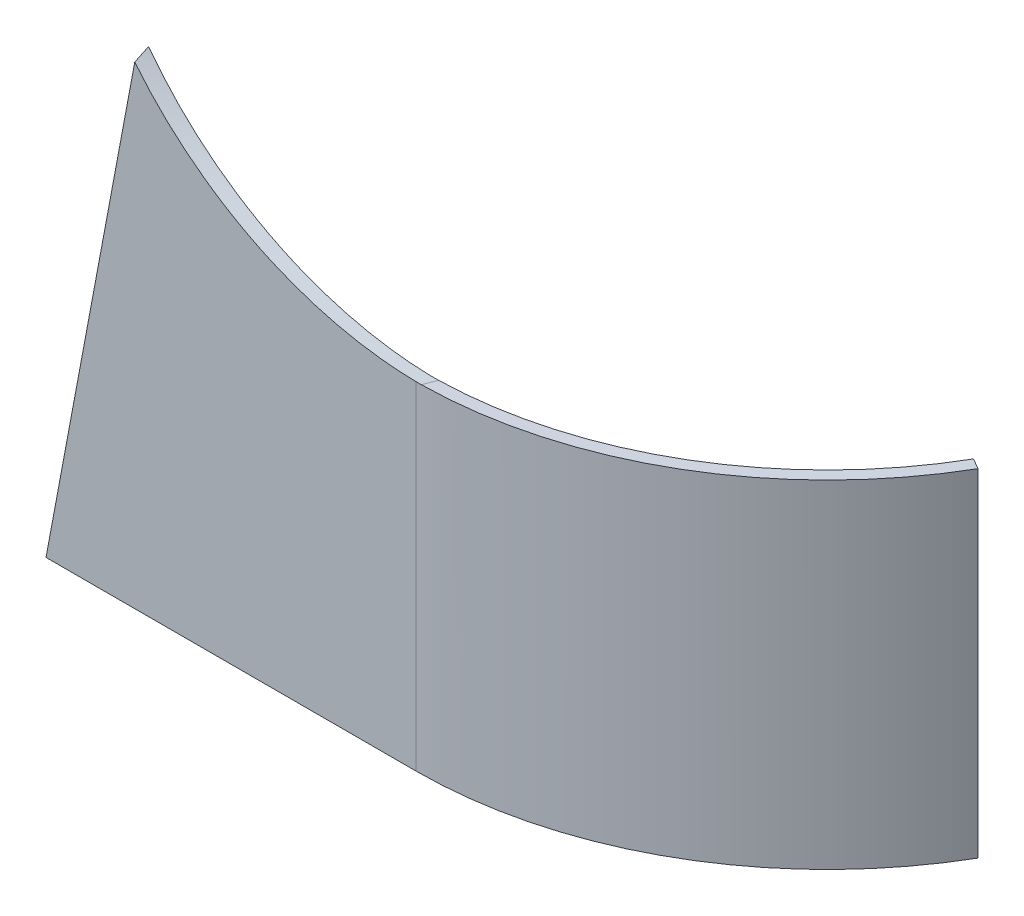
ISO-10303-21;
HEADER;
FILE_DESCRIPTION(('STEP AP214'),'2;1');
FILE_NAME('part.step','',(''),(''),'','','');
FILE_SCHEMA(('AUTOMOTIVE_DESIGN { 1 0 10303 214 1 1 1 1 }'));
ENDSEC;
DATA;
#1=APPLICATION_CONTEXT('core data for automotive mechanical design processes');
#2=APPLICATION_PROTOCOL_DEFINITION('international standard','automotive_design',2000,#1);
#3=PRODUCT_CONTEXT('',#1,'mechanical');
#4=PRODUCT('Part','Part','',(#3));
#5=PRODUCT_RELATED_PRODUCT_CATEGORY('part','',(#4));
#6=PRODUCT_DEFINITION_FORMATION('','',#4);
#7=PRODUCT_DEFINITION_CONTEXT('part definition',#1,'design');
#8=PRODUCT_DEFINITION('design','',#6,#7);
#9=PRODUCT_DEFINITION_SHAPE('','',#8);
#10=(LENGTH_UNIT() NAMED_UNIT(*) SI_UNIT(.MILLI.,.METRE.));
#11=(NAMED_UNIT(*) PLANE_ANGLE_UNIT() SI_UNIT($,.RADIAN.));
#12=(NAMED_UNIT(*) SI_UNIT($,.STERADIAN.) SOLID_ANGLE_UNIT());
#13=UNCERTAINTY_MEASURE_WITH_UNIT(LENGTH_MEASURE(1.E-05),#10,'distance_accuracy_value','');
#14=(GEOMETRIC_REPRESENTATION_CONTEXT(3) GLOBAL_UNCERTAINTY_ASSIGNED_CONTEXT((#13)) GLOBAL_UNIT_ASSIGNED_CONTEXT((#10,
#11,#12)) REPRESENTATION_CONTEXT('',''));
#15=CARTESIAN_POINT('',(0.,0.,0.));
#16=DIRECTION('',(0.,0.,1.));
#17=DIRECTION('',(1.,0.,0.));
#18=AXIS2_PLACEMENT_3D('',#15,#16,#17);
#19=CARTESIAN_POINT('',(122.5,120.,-3.));
#20=DIRECTION('',(0.,0.,1.));
#21=DIRECTION('',(1.,0.,0.));
#22=AXIS2_PLACEMENT_3D('',#19,#20,#21);
#23=PLANE('',#22);
#24=DIRECTION('',(0.184288535050186,0.982872186934322,0.));
#25=VECTOR('',#24,1.);
#26=CARTESIAN_POINT('',(144.235849056604,115.924528301887,-3.));
#27=LINE('',#26,#25);
#28=CARTESIAN_POINT('',(122.5,0.,-3.));
#29=VERTEX_POINT('',#28);
#30=CARTESIAN_POINT('',(144.449211768772,117.062462766784,-3.));
#31=VERTEX_POINT('',#30);
#32=EDGE_CURVE('E118',#29,#31,#27,.T.);
#33=ORIENTED_EDGE('',*,*,#32,.T.);
#34=CARTESIAN_POINT('',(143.673237699564,118.133691395867,-3.));
#35=CARTESIAN_POINT('',(145.058177379041,116.187117329974,-3.));
#36=CARTESIAN_POINT('',(146.532992275024,114.30476306379,-3.));
#37=CARTESIAN_POINT('',(149.643497727013,110.67657896662,-3.));
#38=CARTESIAN_POINT('',(151.279273521575,108.930822360353,-3.));
#39=CARTESIAN_POINT('',(154.696850390186,105.580969533702,-3.));
#40=CARTESIAN_POINT('',(156.478972813361,103.977202044654,-3.));
#41=CARTESIAN_POINT('',(160.169650651045,100.922694994159,-3.));
#42=CARTESIAN_POINT('',(162.078188431621,99.471934162384,-3.));
#43=CARTESIAN_POINT('',(165.019897191491,97.4185329730634,-3.));
#44=CARTESIAN_POINT('',(166.011604799179,96.7556976319401,-3.));
#45=CARTESIAN_POINT('',(168.020814340732,95.4703511333913,-3.));
#46=CARTESIAN_POINT('',(169.038314705919,94.8478375318056,-3.));
#47=CARTESIAN_POINT('',(171.097274938425,93.6439670925554,-3.));
#48=CARTESIAN_POINT('',(172.13873310996,93.0626073537376,-3.));
#49=CARTESIAN_POINT('',(174.244127425099,91.9416623237355,-3.));
#50=CARTESIAN_POINT('',(175.308068622042,91.4020865539146,-3.));
#51=CARTESIAN_POINT('',(178.529126053998,89.8481664579845,-3.));
#52=CARTESIAN_POINT('',(180.717377743625,88.8975183162061,-3.));
#53=CARTESIAN_POINT('',(185.162405311066,87.172726808613,-3.));
#54=CARTESIAN_POINT('',(187.419182083386,86.3985857479897,-3.));
#55=CARTESIAN_POINT('',(190.912366356633,85.3539301838452,-3.));
#56=CARTESIAN_POINT('',(192.129488293874,85.0177875984566,-3.));
#57=CARTESIAN_POINT('',(194.576680828704,84.397467012642,-3.));
#58=CARTESIAN_POINT('',(195.806748400566,84.1132771427823,-3.));
#59=CARTESIAN_POINT('',(198.27802723205,83.5975351161429,-3.));
#60=CARTESIAN_POINT('',(199.519239964667,83.3659900268241,-3.));
#61=CARTESIAN_POINT('',(202.010532073176,82.9562924068783,-3.));
#62=CARTESIAN_POINT('',(203.260611974409,82.7781430672196,-3.));
#63=CARTESIAN_POINT('',(205.767444449707,82.475910435858,-3.));
#64=CARTESIAN_POINT('',(207.024197795381,82.351833540347,-3.));
#65=CARTESIAN_POINT('',(209.542036441427,82.1583730247636,-3.));
#66=CARTESIAN_POINT('',(210.803122151848,82.0889947335366,-3.));
#67=CARTESIAN_POINT('',(213.326969733707,82.005490252727,-3.));
#68=CARTESIAN_POINT('',(214.589731377001,81.9913571876713,-3.));
#69=CARTESIAN_POINT('',(217.114777779149,82.0187768818219,-3.));
#70=CARTESIAN_POINT('',(218.377062481712,82.0603348995464,-3.));
#71=CARTESIAN_POINT('',(220.871047832146,82.1979879263606,-3.));
#72=CARTESIAN_POINT('',(222.102815231951,82.2928740663927,-3.));
#73=CARTESIAN_POINT('',(224.561135378192,82.5365391980151,-3.));
#74=CARTESIAN_POINT('',(225.787687614448,82.6853233448692,-3.));
#75=CARTESIAN_POINT('',(228.232916508349,83.0369124853259,-3.));
#76=CARTESIAN_POINT('',(229.451593875853,83.239712538211,-3.));
#77=CARTESIAN_POINT('',(231.87883724139,83.6994012941054,-3.));
#78=CARTESIAN_POINT('',(233.087402219185,83.9562953878435,-3.));
#79=CARTESIAN_POINT('',(235.491424291013,84.523999082432,-3.));
#80=CARTESIAN_POINT('',(236.686885225723,84.8347924109143,-3.));
#81=CARTESIAN_POINT('',(239.062525018667,85.5101510275368,-3.));
#82=CARTESIAN_POINT('',(240.242703912869,85.8747161890985,-3.));
#83=CARTESIAN_POINT('',(242.585159697455,86.6572778882289,-3.));
#84=CARTESIAN_POINT('',(243.747437375341,87.0752720678077,-3.));
#85=CARTESIAN_POINT('',(246.051553077031,87.9642482865061,-3.));
#86=CARTESIAN_POINT('',(247.193391238285,88.4352299691449,-3.));
#87=CARTESIAN_POINT('',(249.388192579403,89.4006279781757,-3.));
#88=CARTESIAN_POINT('',(250.442459261764,89.8920826976512,-3.));
#89=CARTESIAN_POINT('',(252.528470146798,90.9208874785217,-3.));
#90=CARTESIAN_POINT('',(253.560212413333,91.4582414659442,-3.));
#91=CARTESIAN_POINT('',(255.598812912258,92.5780400800493,-3.));
#92=CARTESIAN_POINT('',(256.605674109108,93.1604793005394,-3.));
#93=CARTESIAN_POINT('',(258.592455143712,94.3696156675639,-3.));
#94=CARTESIAN_POINT('',(259.572372274103,94.9963172392052,-3.));
#95=CARTESIAN_POINT('',(262.467953229766,96.9411491113451,-3.));
#96=CARTESIAN_POINT('',(264.340592476272,98.3246352534475,-3.));
#97=CARTESIAN_POINT('',(267.048825134597,100.522278274388,-3.));
#98=CARTESIAN_POINT('',(267.934873310533,101.275317561614,-3.));
#99=CARTESIAN_POINT('',(269.671703400627,102.821075087832,-3.));
#100=CARTESIAN_POINT('',(270.522485529944,103.613793084677,-3.));
#101=CARTESIAN_POINT('',(272.923321570142,105.956149911441,-3.));
#102=CARTESIAN_POINT('',(274.426007286468,107.554891357421,-3.));
#103=CARTESIAN_POINT('',(277.28576542293,110.877312712686,-3.));
#104=CARTESIAN_POINT('',(278.642843457829,112.600987800121,-3.));
#105=CARTESIAN_POINT('',(281.19964640717,116.16094388,-3.));
#106=CARTESIAN_POINT('',(282.399402944905,117.997202132789,-3.));
#107=CARTESIAN_POINT('',(284.631139148049,121.768984663578,-3.));
#108=CARTESIAN_POINT('',(285.663123148544,123.704506375003,-3.));
#109=CARTESIAN_POINT('',(287.510316677582,127.576804540793,-3.));
#110=CARTESIAN_POINT('',(288.332816253327,129.510106548861,-3.));
#111=CARTESIAN_POINT('',(289.808389360774,133.440305470025,-3.));
#112=CARTESIAN_POINT('',(290.461468042075,135.437200448122,-3.));
#113=CARTESIAN_POINT('',(291.592570319373,139.479702648517,-3.));
#114=CARTESIAN_POINT('',(292.070616152892,141.525303647631,-3.));
#115=CARTESIAN_POINT('',(292.84765305219,145.650242258279,-3.));
#116=CARTESIAN_POINT('',(293.146645997838,147.729579515383,-3.));
#117=CARTESIAN_POINT('',(293.558037512073,151.856592054945,-3.));
#118=CARTESIAN_POINT('',(293.674709026705,153.903842540772,-3.));
#119=CARTESIAN_POINT('',(293.734006483403,158.000838729222,-3.));
#120=CARTESIAN_POINT('',(293.67663571899,160.050584383893,-3.));
#121=CARTESIAN_POINT('',(293.38833602932,164.137708277383,-3.));
#122=CARTESIAN_POINT('',(293.157416893337,166.175087207233,-3.));
#123=CARTESIAN_POINT('',(292.523940156375,170.2229816184,-3.));
#124=CARTESIAN_POINT('',(292.121382329158,172.233497064305,-3.));
#125=CARTESIAN_POINT('',(291.150792486779,176.201684868235,-3.));
#126=CARTESIAN_POINT('',(290.583742575278,178.159597605676,-3.));
#127=CARTESIAN_POINT('',(289.287861691571,182.021097789261,-3.));
#128=CARTESIAN_POINT('',(288.559031906338,183.924685633871,-3.));
#129=CARTESIAN_POINT('',(286.945401755018,187.664550318031,-3.));
#130=CARTESIAN_POINT('',(286.0606006358,189.500826832508,-3.));
#131=CARTESIAN_POINT('',(284.141994580788,193.093799131478,-3.));
#132=CARTESIAN_POINT('',(283.10818806509,194.850494071909,-3.));
#133=CARTESIAN_POINT('',(280.886976706008,198.292401310609,-3.));
#134=CARTESIAN_POINT('',(279.697954059499,199.976569432313,-3.));
#135=CARTESIAN_POINT('',(277.1849390743,203.240954758854,-3.));
#136=CARTESIAN_POINT('',(275.860946219888,204.821171566456,-3.));
#137=CARTESIAN_POINT('',(273.087991609944,207.867984432196,-3.));
#138=CARTESIAN_POINT('',(271.639022466203,209.33457376329,-3.));
#139=CARTESIAN_POINT('',(268.626948023631,212.14541204371,-3.));
#140=CARTESIAN_POINT('',(267.063840670692,213.4896587903,-3.));
#141=CARTESIAN_POINT('',(263.789508406174,216.084230624631,-3.));
#142=CARTESIAN_POINT('',(262.075359476651,217.3308658578,-3.));
#143=CARTESIAN_POINT('',(258.55112420044,219.680141386512,-3.));
#144=CARTESIAN_POINT('',(256.741036454252,220.782779580693,-3.));
#145=CARTESIAN_POINT('',(253.037730346797,222.838704070419,-3.));
#146=CARTESIAN_POINT('',(251.144502700255,223.79197362951,-3.));
#147=CARTESIAN_POINT('',(247.288233502909,225.544849881986,-3.));
#148=CARTESIAN_POINT('',(245.32519029447,226.34445292397,-3.));
#149=CARTESIAN_POINT('',(241.255625143675,227.818483407032,-3.));
#150=CARTESIAN_POINT('',(239.146577967943,228.485941839349,-3.));
#151=CARTESIAN_POINT('',(234.881506227219,229.648330645654,-3.));
#152=CARTESIAN_POINT('',(232.725480496915,230.143256734763,-3.));
#153=CARTESIAN_POINT('',(228.380547299515,230.959969208325,-3.));
#154=CARTESIAN_POINT('',(226.191634164759,231.281725389387,-3.));
#155=CARTESIAN_POINT('',(221.795340305803,231.752464786127,-3.));
#156=CARTESIAN_POINT('',(219.587959072002,231.901443218308,-3.));
#157=CARTESIAN_POINT('',(215.045332236584,232.031655992637,-3.));
#158=CARTESIAN_POINT('',(212.70980379807,232.003099125375,-3.));
#159=CARTESIAN_POINT('',(208.048638154494,231.757976008296,-3.));
#160=CARTESIAN_POINT('',(205.723001288772,231.54140335989,-3.));
#161=CARTESIAN_POINT('',(201.09602046233,230.924000071026,-3.));
#162=CARTESIAN_POINT('',(198.794680833529,230.523137122828,-3.));
#163=CARTESIAN_POINT('',(194.230411534347,229.54153012856,-3.));
#164=CARTESIAN_POINT('',(191.967482898721,228.960781244628,-3.));
#165=CARTESIAN_POINT('',(188.549866066441,227.939980200869,-3.));
#166=CARTESIAN_POINT('',(187.376020625282,227.562816667015,-3.));
#167=CARTESIAN_POINT('',(185.044830684606,226.760551790786,-3.));
#168=CARTESIAN_POINT('',(183.887485253158,226.335453167995,-3.));
#169=CARTESIAN_POINT('',(181.591277350911,225.438143229603,-3.));
#170=CARTESIAN_POINT('',(180.452413887893,224.965934452938,-3.));
#171=CARTESIAN_POINT('',(178.194782597251,223.975125082385,-3.));
#172=CARTESIAN_POINT('',(177.076019901856,223.456512837108,-3.));
#173=CARTESIAN_POINT('',(173.751941061241,221.831881733072,-3.));
#174=CARTESIAN_POINT('',(171.579635783171,220.657381831809,-3.));
#175=CARTESIAN_POINT('',(167.339383503928,218.13303557342,-3.));
#176=CARTESIAN_POINT('',(165.271434699879,216.783192246994,-3.));
#177=CARTESIAN_POINT('',(162.234493445238,214.614308952247,-3.));
#178=CARTESIAN_POINT('',(161.220915712381,213.857039877914,-3.));
#179=CARTESIAN_POINT('',(159.227752711984,212.299365957405,-3.));
#180=CARTESIAN_POINT('',(158.248159285891,211.498971583704,-3.));
#181=CARTESIAN_POINT('',(156.324897020324,209.855749106859,-3.));
#182=CARTESIAN_POINT('',(155.38123560465,209.012912317464,-3.));
#183=CARTESIAN_POINT('',(153.532386989485,207.285912515636,-3.));
#184=CARTESIAN_POINT('',(152.627202073791,206.401747056634,-3.));
#185=CARTESIAN_POINT('',(150.858736975203,204.594065584097,-3.));
#186=CARTESIAN_POINT('',(149.995418121802,203.670587422827,-3.));
#187=CARTESIAN_POINT('',(148.31243293153,201.784653935562,-3.));
#188=CARTESIAN_POINT('',(147.492766637236,200.822198571552,-3.));
#189=CARTESIAN_POINT('',(145.900117582554,198.859841708872,-3.));
#190=CARTESIAN_POINT('',(145.127120807021,197.859951599695,-3.));
#191=CARTESIAN_POINT('',(143.630490377598,195.823858630875,-3.));
#192=CARTESIAN_POINT('',(142.906859010032,194.787654092714,-3.));
#193=CARTESIAN_POINT('',(141.142302300624,192.12190314093,-3.));
#194=CARTESIAN_POINT('',(140.136457059433,190.468930522743,-3.));
#195=CARTESIAN_POINT('',(138.259212370518,187.088315087955,-3.));
#196=CARTESIAN_POINT('',(137.387792483118,185.360683674633,-3.));
#197=CARTESIAN_POINT('',(136.190742387971,182.720576459129,-3.));
#198=CARTESIAN_POINT('',(135.810166976278,181.832695910481,-3.));
#199=CARTESIAN_POINT('',(135.086950911879,180.041649213322,-3.));
#200=CARTESIAN_POINT('',(134.744306478905,179.138484598411,-3.));
#201=CARTESIAN_POINT('',(134.098305009416,177.318071339209,-3.));
#202=CARTESIAN_POINT('',(133.794953538446,176.400820720281,-3.));
#203=CARTESIAN_POINT('',(133.228950554365,174.553939771533,-3.));
#204=CARTESIAN_POINT('',(132.96629466484,173.624310784579,-3.));
#205=CARTESIAN_POINT('',(132.481415157868,171.748569739219,-3.));
#206=CARTESIAN_POINT('',(132.259445100016,170.802392065564,-3.));
#207=CARTESIAN_POINT('',(131.859011488132,168.900864661512,-3.));
#208=CARTESIAN_POINT('',(131.680547966577,167.945514924269,-3.));
#209=CARTESIAN_POINT('',(131.368058963303,166.027557955918,-3.));
#210=CARTESIAN_POINT('',(131.234033903802,165.064950655944,-3.));
#211=CARTESIAN_POINT('',(131.011150725337,163.134517377107,-3.));
#212=CARTESIAN_POINT('',(130.92229251134,162.166691409228,-3.));
#213=CARTESIAN_POINT('',(130.790241180653,160.227989541764,-3.));
#214=CARTESIAN_POINT('',(130.747045070319,159.257113846309,-3.));
#215=CARTESIAN_POINT('',(130.706551683573,157.314398740613,-3.));
#216=CARTESIAN_POINT('',(130.709254660809,156.342559325076,-3.));
#217=CARTESIAN_POINT('',(130.760542273098,154.400169344428,-3.));
#218=CARTESIAN_POINT('',(130.8091234167,153.429618686866,-3.));
#219=CARTESIAN_POINT('',(130.951888605909,151.491894091262,-3.));
#220=CARTESIAN_POINT('',(131.046071689464,150.524720082417,-3.));
#221=CARTESIAN_POINT('',(131.268172302826,148.689550758649,-3.));
#222=CARTESIAN_POINT('',(131.391923888902,147.821048081292,-3.));
#223=CARTESIAN_POINT('',(131.675634469735,146.089902475662,-3.));
#224=CARTESIAN_POINT('',(131.835596563439,145.227260055431,-3.));
#225=CARTESIAN_POINT('',(132.19102532833,143.509422601234,-3.));
#226=CARTESIAN_POINT('',(132.386487793944,142.654226697675,-3.));
#227=CARTESIAN_POINT('',(132.81212435091,140.952492380124,-3.));
#228=CARTESIAN_POINT('',(133.042301517058,140.105954740122,-3.));
#229=CARTESIAN_POINT('',(133.783254447614,137.582413741809,-3.));
#230=CARTESIAN_POINT('',(134.344752521283,135.920037733688,-3.));
#231=CARTESIAN_POINT('',(135.594763191743,132.644287229191,-3.));
#232=CARTESIAN_POINT('',(136.283256503926,131.030905336175,-3.));
#233=CARTESIAN_POINT('',(137.497860035073,128.455348258921,-3.));
#234=CARTESIAN_POINT('',(137.987945188836,127.476009275178,-3.));
#235=CARTESIAN_POINT('',(139.012019202724,125.540873767587,-3.));
#236=CARTESIAN_POINT('',(139.545998525874,124.585072188061,-3.));
#237=CARTESIAN_POINT('',(141.210587258484,121.755009688714,-3.));
#238=CARTESIAN_POINT('',(142.404180403232,119.917389312664,-3.));
#239=CARTESIAN_POINT('',(143.673237699564,118.133691395867,-3.));
#240=B_SPLINE_CURVE_WITH_KNOTS('',3,(#34,#35,#36,#37,#38,#39,#40,#41,#42,#43,#44,#45,#46,#47,
#48,#49,#50,#51,#52,#53,#54,#55,#56,#57,#58,#59,#60,#61,#62,#63,#64,#65,#66,#67,#68,#69,#70,#71,
#72,#73,#74,#75,#76,#77,#78,#79,#80,#81,#82,#83,#84,#85,#86,#87,#88,#89,#90,#91,#92,#93,#94,#95,
#96,#97,#98,#99,#100,#101,#102,#103,#104,#105,#106,#107,#108,#109,#110,#111,#112,#113,#114,#115,
#116,#117,#118,#119,#120,#121,#122,#123,#124,#125,#126,#127,#128,#129,#130,#131,#132,#133,#134,
#135,#136,#137,#138,#139,#140,#141,#142,#143,#144,#145,#146,#147,#148,#149,#150,#151,#152,#153,
#154,#155,#156,#157,#158,#159,#160,#161,#162,#163,#164,#165,#166,#167,#168,#169,#170,#171,#172,
#173,#174,#175,#176,#177,#178,#179,#180,#181,#182,#183,#184,#185,#186,#187,#188,#189,#190,#191,
#192,#193,#194,#195,#196,#197,#198,#199,#200,#201,#202,#203,#204,#205,#206,#207,#208,#209,#210,
#211,#212,#213,#214,#215,#216,#217,#218,#219,#220,#221,#222,#223,#224,#225,#226,#227,#228,#229,
#230,#231,#232,#233,#234,#235,#236,#237,#238,#239),.UNSPECIFIED.,.T.,.F.,(4,2,2,2,2,2,2,2,2,2,2,
2,2,2,2,2,2,2,2,2,2,2,2,2,2,2,2,2,2,2,2,2,2,2,2,2,2,2,2,2,2,2,2,2,2,2,2,2,2,2,2,2,2,2,2,2,2,2,2,
2,2,2,2,2,2,2,2,2,2,2,2,2,2,2,2,2,2,2,2,2,2,2,2,2,2,2,2,2,2,2,2,2,2,2,2,2,2,2,2,2,2,2,4),(0.,
7.16427698897611,14.3323685263997,21.5166437611093,28.6999189486774,32.2776155183195,
35.8550950173971,39.4323220693657,43.0103618842687,50.1598532207505,57.3094379246025,
61.0965299497326,64.8827556684961,68.6694893810785,72.4564493464879,76.2438571472571,
80.0316338791473,83.8189391931738,87.606602141066,91.311679745278,95.0171118282283,
98.7222050996868,102.427667776225,106.132013701857,109.83635090761,113.540524685762,
117.244673545056,120.73312818273,124.221881507297,127.710217139839,131.198902012017,
138.172364061026,141.659860210734,145.147335079895,151.720662559546,158.293736474672,
164.865487100054,171.437067890608,177.732342153832,184.027425047849,190.321707888268,
196.615924644111,202.760289324478,208.904537731593,215.048439588551,221.192349543866,
227.300306682687,233.408219009104,239.516160829253,245.624167416699,251.801858631401,
257.979573452028,264.157653730594,270.335845221411,276.687250888356,283.038749231525,
289.390958739141,295.743319168345,302.372360180187,309.001565813974,315.631927304812,
322.262472358429,329.26182292495,336.261411704077,343.262228042026,350.26323267672,
353.96120796121,357.658973547597,361.35653995567,365.055037400397,372.454606454222,
379.854047628154,383.648723534398,387.442482065151,391.237020206085,395.031783260741,
398.822971697959,402.614163832866,406.404211727486,410.19443503648,415.993290069168,
421.791262501985,424.688564497802,427.585577482823,430.483000359678,433.380111430234,
436.294705541776,439.209301829052,442.123925807609,445.03854365356,447.952970402987,
450.867413258174,453.781634334439,456.695793932817,459.326858002876,461.95814732838,
464.589125139809,467.220336122579,472.478344457789,477.735555004985,481.019836865781,
484.303407020566,490.868225778044),.UNSPECIFIED.);
#241=CARTESIAN_POINT('',(212.5,82.0339460866671,-3.));
#242=VERTEX_POINT('',#241);
#243=EDGE_CURVE('E52',#31,#242,#240,.T.);
#244=ORIENTED_EDGE('',*,*,#243,.T.);
#245=DIRECTION('',(0.,-1.,0.));
#246=VECTOR('',#245,1.);
#247=CARTESIAN_POINT('',(212.5,120.,-3.));
#248=LINE('',#247,#246);
#249=CARTESIAN_POINT('',(212.5,0.,-3.));
#250=VERTEX_POINT('',#249);
#251=EDGE_CURVE('E59',#242,#250,#248,.T.);
#252=ORIENTED_EDGE('',*,*,#251,.T.);
#253=DIRECTION('',(1.,0.,0.));
#254=VECTOR('',#253,1.);
#255=CARTESIAN_POINT('',(122.5,0.,-3.));
#256=LINE('',#255,#254);
#257=EDGE_CURVE('E126',#250,#29,#256,.F.);
#258=ORIENTED_EDGE('',*,*,#257,.T.);
#259=EDGE_LOOP('',(#33,#244,#252,#258));
#260=FACE_BOUND('',#259,.T.);
#261=ADVANCED_FACE('F37',(#260),#23,.F.);
#262=CARTESIAN_POINT('',(122.5,120.,0.));
#263=DIRECTION('',(0.,0.,1.));
#264=DIRECTION('',(1.,0.,0.));
#265=AXIS2_PLACEMENT_3D('',#262,#263,#264);
#266=PLANE('',#265);
#267=CARTESIAN_POINT('',(142.340085381156,117.360186084993,0.));
#268=CARTESIAN_POINT('',(143.789511218283,115.406611472143,0.));
#269=CARTESIAN_POINT('',(145.329538618973,113.520545826269,0.));
#270=CARTESIAN_POINT('',(148.570668022196,109.8907814443,0.));
#271=CARTESIAN_POINT('',(150.271857878214,108.14716133433,0.));
#272=CARTESIAN_POINT('',(153.819837992689,104.806775008233,0.));
#273=CARTESIAN_POINT('',(155.666955918783,103.210357788101,0.));
#274=CARTESIAN_POINT('',(159.486446827716,100.175464408366,0.));
#275=CARTESIAN_POINT('',(161.458801550484,98.7369653066972,0.));
#276=CARTESIAN_POINT('',(164.49492153323,96.7054628875756,0.));
#277=CARTESIAN_POINT('',(165.517789367641,96.0505103667241,0.));
#278=CARTESIAN_POINT('',(167.588917552738,94.7820716815557,0.));
#279=CARTESIAN_POINT('',(168.637176347235,94.1685829846506,0.));
#280=CARTESIAN_POINT('',(170.757222188307,92.9838971886622,0.));
#281=CARTESIAN_POINT('',(171.829007578706,92.4126971249337,0.));
#282=CARTESIAN_POINT('',(173.994606867205,91.3132107090541,0.));
#283=CARTESIAN_POINT('',(175.088425749672,90.7849342061657,0.));
#284=CARTESIAN_POINT('',(178.398276420758,89.2666454895268,0.));
#285=CARTESIAN_POINT('',(180.644725381426,88.3420442636688,0.));
#286=CARTESIAN_POINT('',(185.203956448688,86.6740517375422,0.));
#287=CARTESIAN_POINT('',(187.516739135517,85.9306620229069,0.));
#288=CARTESIAN_POINT('',(191.09460662944,84.9365144022809,0.));
#289=CARTESIAN_POINT('',(192.341323876712,84.6184145452619,0.));
#290=CARTESIAN_POINT('',(194.846963658589,84.0356594079506,0.));
#291=CARTESIAN_POINT('',(196.105883344956,83.7709919562302,0.));
#292=CARTESIAN_POINT('',(198.634067008822,83.2958126608873,0.));
#293=CARTESIAN_POINT('',(199.903332381114,83.0853082483464,0.));
#294=CARTESIAN_POINT('',(202.449849302158,82.7192424798988,0.));
#295=CARTESIAN_POINT('',(203.727101321164,82.5636843908291,0.));
#296=CARTESIAN_POINT('',(206.287306444755,82.3082173186854,0.));
#297=CARTESIAN_POINT('',(207.570260165678,82.2083145069186,0.));
#298=CARTESIAN_POINT('',(210.139446707925,82.064810220452,0.));
#299=CARTESIAN_POINT('',(211.425679840034,82.0212142968676,0.));
#300=CARTESIAN_POINT('',(213.998657239942,81.990899594309,0.));
#301=CARTESIAN_POINT('',(215.285401420944,82.0041735154414,0.));
#302=CARTESIAN_POINT('',(217.857142882046,82.0880535591521,0.));
#303=CARTESIAN_POINT('',(219.142139999592,82.1586646938248,0.));
#304=CARTESIAN_POINT('',(221.670569065537,82.3547175794788,0.));
#305=CARTESIAN_POINT('',(222.914128606531,82.4785150333607,0.));
#306=CARTESIAN_POINT('',(225.3945844477,82.7807673268444,0.));
#307=CARTESIAN_POINT('',(226.631480816264,82.9592216043718,0.));
#308=CARTESIAN_POINT('',(229.096201127498,83.3709364025163,0.));
#309=CARTESIAN_POINT('',(230.324024522368,83.6042002049296,0.));
#310=CARTESIAN_POINT('',(232.767859028844,84.125525013974,0.));
#311=CARTESIAN_POINT('',(233.983871335531,84.4135804146218,0.));
#312=CARTESIAN_POINT('',(236.401399120117,85.044346768513,0.));
#313=CARTESIAN_POINT('',(237.602917294354,85.3870473820501,0.));
#314=CARTESIAN_POINT('',(239.98894318867,86.1268777336356,0.));
#315=CARTESIAN_POINT('',(241.173452744277,86.5240015489434,0.));
#316=CARTESIAN_POINT('',(243.522953618384,87.3723482154797,0.));
#317=CARTESIAN_POINT('',(244.687944798176,87.8235714509829,0.));
#318=CARTESIAN_POINT('',(246.995720644631,88.7796097253833,0.));
#319=CARTESIAN_POINT('',(248.138505655592,89.2844239325892,0.));
#320=CARTESIAN_POINT('',(250.325580979339,90.3123943971709,0.));
#321=CARTESIAN_POINT('',(251.371439729921,90.8322164561905,0.));
#322=CARTESIAN_POINT('',(253.439314547966,91.9175325199836,0.));
#323=CARTESIAN_POINT('',(254.461328530946,92.4830304985565,0.));
#324=CARTESIAN_POINT('',(256.479094540112,93.6588129036564,0.));
#325=CARTESIAN_POINT('',(257.474849832156,94.2690917246279,0.));
#326=CARTESIAN_POINT('',(259.438152557738,95.533671399807,0.));
#327=CARTESIAN_POINT('',(260.40569714121,96.1879766799729,0.));
#328=CARTESIAN_POINT('',(262.309997845709,97.5393155536238,0.));
#329=CARTESIAN_POINT('',(263.24676404599,98.2363349405416,0.));
#330=CARTESIAN_POINT('',(265.087712497645,99.6721583965646,0.));
#331=CARTESIAN_POINT('',(265.991894791406,100.41096241131,0.));
#332=CARTESIAN_POINT('',(267.765548594951,101.929062710087,0.));
#333=CARTESIAN_POINT('',(268.635021400731,102.708357479754,0.));
#334=CARTESIAN_POINT('',(270.337242852664,104.306076897117,0.));
#335=CARTESIAN_POINT('',(271.169991766667,105.124501259327,0.));
#336=CARTESIAN_POINT('',(272.746383259071,106.747099413186,0.));
#337=CARTESIAN_POINT('',(273.492350270975,107.549016451913,0.));
#338=CARTESIAN_POINT('',(274.948687356165,109.184680184652,0.));
#339=CARTESIAN_POINT('',(275.659054421639,110.018429557706,0.));
#340=CARTESIAN_POINT('',(277.042489716609,111.716142900902,0.));
#341=CARTESIAN_POINT('',(277.71556274556,112.580102959712,0.));
#342=CARTESIAN_POINT('',(279.023096564585,114.336899981799,0.));
#343=CARTESIAN_POINT('',(279.657553534453,115.229739788754,0.));
#344=CARTESIAN_POINT('',(280.886180367254,117.042318315974,0.));
#345=CARTESIAN_POINT('',(281.480362783488,117.962048525558,0.));
#346=CARTESIAN_POINT('',(282.627380612069,119.827068482064,0.));
#347=CARTESIAN_POINT('',(283.180211724307,120.77236087331,0.));
#348=CARTESIAN_POINT('',(284.243146541511,122.686545327015,0.));
#349=CARTESIAN_POINT('',(284.753255471623,123.655434484701,0.));
#350=CARTESIAN_POINT('',(285.729667662867,125.615070043626,0.));
#351=CARTESIAN_POINT('',(286.195966793937,126.605818494746,0.));
#352=CARTESIAN_POINT('',(287.487993570074,129.519001583542,0.));
#353=CARTESIAN_POINT('',(288.254311948832,131.468213838754,0.));
#354=CARTESIAN_POINT('',(289.616133266273,135.425086400622,0.));
#355=CARTESIAN_POINT('',(290.211641736077,137.43274481237,0.));
#356=CARTESIAN_POINT('',(291.226824651471,141.491842781001,0.));
#357=CARTESIAN_POINT('',(291.646522371064,143.543276505053,0.));
#358=CARTESIAN_POINT('',(292.306491304429,147.674791008459,0.));
#359=CARTESIAN_POINT('',(292.546764369132,149.75487149207,0.));
#360=CARTESIAN_POINT('',(292.842161923234,153.877242243422,0.));
#361=CARTESIAN_POINT('',(292.901647638104,155.919221088103,0.));
#362=CARTESIAN_POINT('',(292.84734135467,160.000845249033,0.));
#363=CARTESIAN_POINT('',(292.733552756355,162.040490610284,0.));
#364=CARTESIAN_POINT('',(292.333664772937,166.102694363168,0.));
#365=CARTESIAN_POINT('',(292.047574937988,168.12525369553,0.));
#366=CARTESIAN_POINT('',(291.305475149607,172.138951534635,0.));
#367=CARTESIAN_POINT('',(290.849464794153,174.130089967028,0.));
#368=CARTESIAN_POINT('',(289.773898789984,178.05736282584,0.));
#369=CARTESIAN_POINT('',(289.155140879694,179.993715868595,0.));
#370=CARTESIAN_POINT('',(287.758110436045,183.807960292358,0.));
#371=CARTESIAN_POINT('',(286.979839010355,185.685852079219,0.));
#372=CARTESIAN_POINT('',(285.270013785506,189.370501191741,0.));
#373=CARTESIAN_POINT('',(284.338458355312,191.177257760227,0.));
#374=CARTESIAN_POINT('',(282.32942687133,194.707717051698,0.));
#375=CARTESIAN_POINT('',(281.251949044687,196.431418765281,0.));
#376=CARTESIAN_POINT('',(278.94352490183,199.808012344908,0.));
#377=CARTESIAN_POINT('',(277.710657437053,201.459590648393,0.));
#378=CARTESIAN_POINT('',(275.113151127934,204.655599573453,0.));
#379=CARTESIAN_POINT('',(273.748511600181,206.200029639251,0.));
#380=CARTESIAN_POINT('',(270.897764746628,209.172537174732,0.));
#381=CARTESIAN_POINT('',(269.411649111042,210.600606671202,0.));
#382=CARTESIAN_POINT('',(266.329049642427,213.332155435362,0.));
#383=CARTESIAN_POINT('',(264.732563625861,214.635632236928,0.));
#384=CARTESIAN_POINT('',(261.388323394097,217.150449165209,0.));
#385=CARTESIAN_POINT('',(259.637372592473,218.357538794137,0.));
#386=CARTESIAN_POINT('',(256.043201053362,220.6254016192,0.));
#387=CARTESIAN_POINT('',(254.199978763606,221.686172352707,0.));
#388=CARTESIAN_POINT('',(250.434224803947,223.656599465986,0.));
#389=CARTESIAN_POINT('',(248.511683309695,224.566237056083,0.));
#390=CARTESIAN_POINT('',(244.60072811315,226.230640643255,0.));
#391=CARTESIAN_POINT('',(242.612312724536,226.98540267207,0.));
#392=CARTESIAN_POINT('',(238.484990844059,228.370472890102,0.));
#393=CARTESIAN_POINT('',(236.34346236196,228.992971647175,0.));
#394=CARTESIAN_POINT('',(232.017321882681,230.063714448046,0.));
#395=CARTESIAN_POINT('',(229.832708689474,230.511953647236,0.));
#396=CARTESIAN_POINT('',(225.434489249077,231.234154449401,0.));
#397=CARTESIAN_POINT('',(223.220877490169,231.508082416004,0.));
#398=CARTESIAN_POINT('',(218.779074826208,231.882584537071,0.));
#399=CARTESIAN_POINT('',(216.550883491876,231.983153563888,0.));
#400=CARTESIAN_POINT('',(211.956702640893,232.013867845141,0.));
#401=CARTESIAN_POINT('',(209.590637751784,231.933189830112,0.));
#402=CARTESIAN_POINT('',(204.872629335596,231.582292882448,0.));
#403=CARTESIAN_POINT('',(202.520686342184,231.312066831664,0.));
#404=CARTESIAN_POINT('',(197.845180496147,230.586304608852,0.));
#405=CARTESIAN_POINT('',(195.521622817977,230.130735154221,0.));
#406=CARTESIAN_POINT('',(190.917285549543,229.039220652634,0.));
#407=CARTESIAN_POINT('',(188.636507183088,228.4032704538,0.));
#408=CARTESIAN_POINT('',(183.99368429599,226.912191016098,0.));
#409=CARTESIAN_POINT('',(181.635166922911,226.046059947109,0.));
#410=CARTESIAN_POINT('',(176.996946174213,224.123466718999,0.));
#411=CARTESIAN_POINT('',(174.717246732282,223.066995076557,0.));
#412=CARTESIAN_POINT('',(170.25031275953,220.7696495856,0.));
#413=CARTESIAN_POINT('',(168.063155929018,219.528624580337,0.));
#414=CARTESIAN_POINT('',(163.799074336811,216.869726183698,0.));
#415=CARTESIAN_POINT('',(161.722148835831,215.451853978593,0.));
#416=CARTESIAN_POINT('',(157.645584629048,212.409229179121,0.));
#417=CARTESIAN_POINT('',(155.649089894894,210.780256200822,0.));
#418=CARTESIAN_POINT('',(151.80814078958,207.351189212956,0.));
#419=CARTESIAN_POINT('',(149.96370470811,205.551074674304,0.));
#420=CARTESIAN_POINT('',(146.450839638022,201.790414618313,0.));
#421=CARTESIAN_POINT('',(144.782198154348,199.830067997812,0.));
#422=CARTESIAN_POINT('',(141.642982357779,195.756954333473,0.));
#423=CARTESIAN_POINT('',(140.172333396052,193.644245198627,0.));
#424=CARTESIAN_POINT('',(137.819420323467,189.863023596192,0.));
#425=CARTESIAN_POINT('',(136.884974436747,188.226786652569,0.));
#426=CARTESIAN_POINT('',(135.148142891667,184.885380649099,0.));
#427=CARTESIAN_POINT('',(134.34573476254,183.180223380073,0.));
#428=CARTESIAN_POINT('',(133.250434682722,180.578277000737,0.));
#429=CARTESIAN_POINT('',(132.903488350272,179.703904351323,0.));
#430=CARTESIAN_POINT('',(132.246884452459,177.941299324809,0.));
#431=CARTESIAN_POINT('',(131.937222937922,177.053068426842,0.));
#432=CARTESIAN_POINT('',(131.356502088512,175.263934844824,0.));
#433=CARTESIAN_POINT('',(131.085448458643,174.363030309585,0.));
#434=CARTESIAN_POINT('',(130.583290108341,172.550244918798,0.));
#435=CARTESIAN_POINT('',(130.352181083221,171.638365257342,0.));
#436=CARTESIAN_POINT('',(129.929756795881,169.799611990845,0.));
#437=CARTESIAN_POINT('',(129.738690871512,168.872681037773,0.));
#438=CARTESIAN_POINT('',(129.399140742527,167.01104304953,0.));
#439=CARTESIAN_POINT('',(129.250656567013,166.076336009044,0.));
#440=CARTESIAN_POINT('',(128.997091494817,164.201040198153,0.));
#441=CARTESIAN_POINT('',(128.892010872111,163.26045139066,0.));
#442=CARTESIAN_POINT('',(128.725854878415,161.375392090559,0.));
#443=CARTESIAN_POINT('',(128.66477942292,160.430921605411,0.));
#444=CARTESIAN_POINT('',(128.586988547824,158.540124060027,0.));
#445=CARTESIAN_POINT('',(128.570274505359,157.593796943069,0.));
#446=CARTESIAN_POINT('',(128.581309077018,155.701396825528,0.));
#447=CARTESIAN_POINT('',(128.60905792507,154.755323826308,0.));
#448=CARTESIAN_POINT('',(128.70885156991,152.865585214996,0.));
#449=CARTESIAN_POINT('',(128.780893398389,151.921919445838,0.));
#450=CARTESIAN_POINT('',(128.968851912344,150.038984533415,0.));
#451=CARTESIAN_POINT('',(129.084767743309,149.099715304883,0.));
#452=CARTESIAN_POINT('',(129.346936135149,147.315184779633,0.));
#453=CARTESIAN_POINT('',(129.489333112023,146.469354077442,0.));
#454=CARTESIAN_POINT('',(129.808996817445,144.784236338022,0.));
#455=CARTESIAN_POINT('',(129.986266510356,143.944949863396,0.));
#456=CARTESIAN_POINT('',(130.374880916959,142.274406582184,0.));
#457=CARTESIAN_POINT('',(130.586221521239,141.443148820026,0.));
#458=CARTESIAN_POINT('',(131.042113778301,139.789766766533,0.));
#459=CARTESIAN_POINT('',(131.286668324649,138.967643277726,0.));
#460=CARTESIAN_POINT('',(132.068426685565,136.517725516886,0.));
#461=CARTESIAN_POINT('',(132.654020495233,134.90512309275,0.));
#462=CARTESIAN_POINT('',(133.945658632915,131.729413203333,0.));
#463=CARTESIAN_POINT('',(134.651687111545,130.166299257345,0.));
#464=CARTESIAN_POINT('',(135.904300898263,127.642009532596,0.));
#465=CARTESIAN_POINT('',(136.418269240932,126.664497016969,0.));
#466=CARTESIAN_POINT('',(137.490096812131,124.734150312747,0.));
#467=CARTESIAN_POINT('',(138.047946928653,123.781311055107,0.));
#468=CARTESIAN_POINT('',(139.783871448053,120.961700526355,0.));
#469=CARTESIAN_POINT('',(141.024667018481,119.13314186705,0.));
#470=CARTESIAN_POINT('',(142.340085381156,117.360186084993,0.));
#471=B_SPLINE_CURVE_WITH_KNOTS('',3,(#267,#268,#269,#270,#271,#272,#273,#274,#275,#276,#277,
#278,#279,#280,#281,#282,#283,#284,#285,#286,#287,#288,#289,#290,#291,#292,#293,#294,#295,#296,
#297,#298,#299,#300,#301,#302,#303,#304,#305,#306,#307,#308,#309,#310,#311,#312,#313,#314,#315,
#316,#317,#318,#319,#320,#321,#322,#323,#324,#325,#326,#327,#328,#329,#330,#331,#332,#333,#334,
#335,#336,#337,#338,#339,#340,#341,#342,#343,#344,#345,#346,#347,#348,#349,#350,#351,#352,#353,
#354,#355,#356,#357,#358,#359,#360,#361,#362,#363,#364,#365,#366,#367,#368,#369,#370,#371,#372,
#373,#374,#375,#376,#377,#378,#379,#380,#381,#382,#383,#384,#385,#386,#387,#388,#389,#390,#391,
#392,#393,#394,#395,#396,#397,#398,#399,#400,#401,#402,#403,#404,#405,#406,#407,#408,#409,#410,
#411,#412,#413,#414,#415,#416,#417,#418,#419,#420,#421,#422,#423,#424,#425,#426,#427,#428,#429,
#430,#431,#432,#433,#434,#435,#436,#437,#438,#439,#440,#441,#442,#443,#444,#445,#446,#447,#448,
#449,#450,#451,#452,#453,#454,#455,#456,#457,#458,#459,#460,#461,#462,#463,#464,#465,#466,#467,
#468,#469,#470),.UNSPECIFIED.,.T.,.F.,(4,2,2,2,2,2,2,2,2,2,2,2,2,2,2,2,2,2,2,2,2,2,2,2,2,2,2,2,
2,2,2,2,2,2,2,2,2,2,2,2,2,2,2,2,2,2,2,2,2,2,2,2,2,2,2,2,2,2,2,2,2,2,2,2,2,2,2,2,2,2,2,2,2,2,2,2,
2,2,2,2,2,2,2,2,2,2,2,2,2,2,2,2,2,2,2,2,2,2,2,2,2,4),(0.,7.29494137436176,14.5938825313826,
21.9097058859828,29.2244650001691,32.8674330878738,36.5101784635837,40.152668222281,
43.7959914419816,51.0757059898389,58.3554842342203,62.2144657371966,66.0725672041017,
69.9311977143906,73.7900576011834,77.649345290564,81.5090134256946,85.3681861432297,
89.2276962441052,92.9756195201513,96.7235042549686,100.471613456794,104.219339378224,
107.966357012509,111.712967191605,115.45960398489,119.206182641705,122.70882679837,
126.211776013553,129.714287483761,133.217151587299,136.718856907568,140.220557672363,
143.722127566747,147.223671917871,150.508350860307,153.793306856545,157.077839117592,
160.362695784247,163.646523830037,166.930692886525,170.214459683573,173.498535739779,
179.773448082734,186.048157210193,192.322035422664,198.595848913391,204.717064285995,
210.838159549616,216.958915570017,223.079686071803,229.170996158436,235.262263948222,
241.353596556954,247.445003177697,253.620888857023,259.796806568146,265.973147107804,
272.149609873492,278.522569668188,284.895636710229,291.269495493915,297.643517569888,
304.326616251198,311.009900716742,317.694474447022,324.379245891668,331.473734751772,
338.568490047404,345.664519929622,352.760752502819,360.289769034621,367.819160787744,
375.35475373615,382.890296139376,390.610617979121,398.331867072292,406.043673205801,
413.75256357659,419.400218330123,425.046910944622,427.86829890685,430.689387766815,
433.510893061455,436.332094102723,439.170371784176,442.008651405457,444.846948942535,
447.685241029056,450.5236212252,453.362016354598,456.200221288698,459.038370947537,
461.61084077605,464.183529372506,466.755907899836,469.328510674258,474.469842417029,
479.610498074105,482.922586225883,486.233988432027,492.854471931542),.UNSPECIFIED.);
#472=CARTESIAN_POINT('',(144.08121928737,115.099836199307,0.));
#473=VERTEX_POINT('',#472);
#474=CARTESIAN_POINT('',(212.5,82.0088146693984,0.));
#475=VERTEX_POINT('',#474);
#476=EDGE_CURVE('E102',#473,#475,#471,.T.);
#477=ORIENTED_EDGE('',*,*,#476,.F.);
#478=DIRECTION('',(0.184288535050186,0.982872186934322,0.));
#479=VECTOR('',#478,1.);
#480=CARTESIAN_POINT('',(144.235849056604,115.924528301887,0.));
#481=LINE('',#480,#479);
#482=CARTESIAN_POINT('',(122.5,0.,0.));
#483=VERTEX_POINT('',#482);
#484=EDGE_CURVE('E121',#483,#473,#481,.T.);
#485=ORIENTED_EDGE('',*,*,#484,.F.);
#486=DIRECTION('',(-1.,0.,0.));
#487=VECTOR('',#486,1.);
#488=CARTESIAN_POINT('',(122.5,0.,0.));
#489=LINE('',#488,#487);
#490=CARTESIAN_POINT('',(212.5,0.,0.));
#491=VERTEX_POINT('',#490);
#492=EDGE_CURVE('E132',#491,#483,#489,.T.);
#493=ORIENTED_EDGE('',*,*,#492,.F.);
#494=DIRECTION('',(0.,-1.,0.));
#495=VECTOR('',#494,1.);
#496=CARTESIAN_POINT('',(212.5,120.,0.));
#497=LINE('',#496,#495);
#498=EDGE_CURVE('E148',#475,#491,#497,.T.);
#499=ORIENTED_EDGE('',*,*,#498,.F.);
#500=EDGE_LOOP('',(#477,#485,#493,#499));
#501=FACE_BOUND('',#500,.T.);
#502=ADVANCED_FACE('F194',(#501),#266,.T.);
#503=CARTESIAN_POINT('',(212.5,0.,-3.));
#504=DIRECTION('',(0.,-1.,0.));
#505=DIRECTION('',(0.,0.,-1.));
#506=AXIS2_PLACEMENT_3D('',#503,#504,#505);
#507=PLANE('',#506);
#508=DIRECTION('',(0.,0.,1.));
#509=VECTOR('',#508,1.);
#510=CARTESIAN_POINT('',(212.5,0.,-3.));
#511=LINE('',#510,#509);
#512=EDGE_CURVE('E150',#250,#491,#511,.T.);
#513=ORIENTED_EDGE('',*,*,#512,.F.);
#514=CARTESIAN_POINT('',(212.5,0.,-100.));
#515=DIRECTION('',(0.,1.,0.));
#516=DIRECTION('',(1.,0.,0.));
#517=AXIS2_PLACEMENT_3D('',#514,#515,#516);
#518=CIRCLE('',#517,97.);
#519=CARTESIAN_POINT('',(296.50446416709,0.,-51.5));
#520=VERTEX_POINT('',#519);
#521=EDGE_CURVE('E141',#520,#250,#518,.F.);
#522=ORIENTED_EDGE('',*,*,#521,.F.);
#523=DIRECTION('',(0.866025403784442,0.,0.499999999999993));
#524=VECTOR('',#523,1.);
#525=CARTESIAN_POINT('',(296.50446416709,0.,-51.5));
#526=LINE('',#525,#524);
#527=CARTESIAN_POINT('',(299.102540378444,0.,-50.));
#528=VERTEX_POINT('',#527);
#529=EDGE_CURVE('E138',#520,#528,#526,.T.);
#530=ORIENTED_EDGE('',*,*,#529,.T.);
#531=CARTESIAN_POINT('',(212.5,0.,-100.));
#532=DIRECTION('',(0.,-1.,0.));
#533=DIRECTION('',(0.,0.,-1.));
#534=AXIS2_PLACEMENT_3D('',#531,#532,#533);
#535=CIRCLE('',#534,100.);
#536=EDGE_CURVE('E135',#528,#491,#535,.T.);
#537=ORIENTED_EDGE('',*,*,#536,.T.);
#538=EDGE_LOOP('',(#513,#522,#530,#537));
#539=FACE_BOUND('',#538,.T.);
#540=ADVANCED_FACE('F39',(#539),#507,.T.);
#541=CARTESIAN_POINT('',(212.5,120.,-100.));
#542=DIRECTION('',(0.,-1.,0.));
#543=DIRECTION('',(0.,0.,-1.));
#544=AXIS2_PLACEMENT_3D('',#541,#542,#543);
#545=CYLINDRICAL_SURFACE('',#544,100.);
#546=CARTESIAN_POINT('',(212.4998,82.0088175121351,-2.00007365783102E-10));
#547=CARTESIAN_POINT('',(213.168016916089,81.9993184791015,4.39958336149057E-06));
#548=CARTESIAN_POINT('',(213.836300292368,81.9975266833393,-0.00669570179467216));
#549=CARTESIAN_POINT('',(215.172450302126,82.0090441117701,-0.033483537442227));
#550=CARTESIAN_POINT('',(215.840316947121,82.0223528983714,-0.0535708837629968));
#551=CARTESIAN_POINT('',(217.837912659925,82.0843167496328,-0.133697295389685));
#552=CARTESIAN_POINT('',(219.166263101597,82.1549483410151,-0.213601314889979));
#553=CARTESIAN_POINT('',(221.814501670057,82.3522895138374,-0.425883142768046));
#554=CARTESIAN_POINT('',(223.134389941933,82.4789981311893,-0.558260049016862));
#555=CARTESIAN_POINT('',(225.106983404955,82.7092766366953,-0.795640962983956));
#556=CARTESIAN_POINT('',(225.764439573868,82.7929185303822,-0.881419466435392));
#557=CARTESIAN_POINT('',(227.075742473858,82.9732631633819,-1.06574853273566));
#558=CARTESIAN_POINT('',(227.729589305757,83.0699655359308,-1.16429873692691));
#559=CARTESIAN_POINT('',(228.381443638432,83.1730263850957,-1.26915503268855));
#560=B_SPLINE_CURVE_WITH_KNOTS('',3,(#546,#547,#548,#549,#550,#551,#552,#553,#554,#555,#556,
#557,#558,#559),.UNSPECIFIED.,.F.,.F.,(4,2,2,2,2,2,4),(0.,2.00469327681905,4.00932846219046,
8.00474367392994,12.0000901983211,14.0047140962272,16.0092817120568),.UNSPECIFIED.);
#561=CARTESIAN_POINT('',(213.743011671938,82.,-0.00772568851424571));
#562=VERTEX_POINT('',#561);
#563=EDGE_CURVE('E96',#475,#562,#560,.T.);
#564=ORIENTED_EDGE('',*,*,#563,.F.);
#565=ORIENTED_EDGE('',*,*,#498,.T.);
#566=ORIENTED_EDGE('',*,*,#536,.F.);
#567=DIRECTION('',(0.,-1.,0.));
#568=VECTOR('',#567,1.);
#569=CARTESIAN_POINT('',(299.102540378444,120.,-50.));
#570=LINE('',#569,#568);
#571=CARTESIAN_POINT('',(299.102540378444,82.,-50.));
#572=VERTEX_POINT('',#571);
#573=EDGE_CURVE('E117',#572,#528,#570,.T.);
#574=ORIENTED_EDGE('',*,*,#573,.F.);
#575=CARTESIAN_POINT('',(212.5,82.,-100.));
#576=DIRECTION('',(0.,-1.,0.));
#577=DIRECTION('',(0.,0.,-1.));
#578=AXIS2_PLACEMENT_3D('',#575,#576,#577);
#579=CIRCLE('',#578,100.);
#580=EDGE_CURVE('E111',#562,#572,#579,.F.);
#581=ORIENTED_EDGE('',*,*,#580,.F.);
#582=EDGE_LOOP('',(#564,#565,#566,#574,#581));
#583=FACE_BOUND('',#582,.T.);
#584=ADVANCED_FACE('F115',(#583),#545,.T.);
#585=CARTESIAN_POINT('',(296.50446416709,120.,-51.5));
#586=DIRECTION('',(0.499999999999993,0.,-0.866025403784442));
#587=DIRECTION('',(-0.866025403784442,0.,-0.499999999999993));
#588=AXIS2_PLACEMENT_3D('',#585,#586,#587);
#589=PLANE('',#588);
#590=DIRECTION('',(-0.866025403784442,0.,-0.499999999999993));
#591=VECTOR('',#590,1.);
#592=CARTESIAN_POINT('',(296.50446416709,82.,-51.5));
#593=LINE('',#592,#591);
#594=CARTESIAN_POINT('',(296.50446416709,82.,-51.5));
#595=VERTEX_POINT('',#594);
#596=EDGE_CURVE('E106',#572,#595,#593,.T.);
#597=ORIENTED_EDGE('',*,*,#596,.F.);
#598=ORIENTED_EDGE('',*,*,#573,.T.);
#599=ORIENTED_EDGE('',*,*,#529,.F.);
#600=DIRECTION('',(0.,-1.,0.));
#601=VECTOR('',#600,1.);
#602=CARTESIAN_POINT('',(296.50446416709,120.,-51.5));
#603=LINE('',#602,#601);
#604=EDGE_CURVE('E145',#595,#520,#603,.T.);
#605=ORIENTED_EDGE('',*,*,#604,.F.);
#606=EDGE_LOOP('',(#597,#598,#599,#605));
#607=FACE_BOUND('',#606,.T.);
#608=ADVANCED_FACE('F188',(#607),#589,.T.);
#609=CARTESIAN_POINT('',(212.5,120.,-100.));
#610=DIRECTION('',(0.,-1.,0.));
#611=DIRECTION('',(0.,0.,-1.));
#612=AXIS2_PLACEMENT_3D('',#609,#610,#611);
#613=CYLINDRICAL_SURFACE('',#612,97.);
#614=ORIENTED_EDGE('',*,*,#251,.F.);
#615=CARTESIAN_POINT('',(212.4998,82.0339516972849,-3.0000000002062));
#616=CARTESIAN_POINT('',(213.167514400678,82.0152187593355,-2.99999532527021));
#617=CARTESIAN_POINT('',(213.835403302975,82.0043014141099,-3.00689243915167));
#618=CARTESIAN_POINT('',(215.170952376244,81.9977825954581,-3.03448023487117));
#619=CARTESIAN_POINT('',(215.838612553399,82.0021806688177,-3.05517050852697));
#620=CARTESIAN_POINT('',(217.835623293665,82.0377881860374,-3.1377174542866));
#621=CARTESIAN_POINT('',(219.163834591331,82.0912805809878,-3.22005071856703));
#622=CARTESIAN_POINT('',(221.812181834519,82.2551271886094,-3.43888561632458));
#623=CARTESIAN_POINT('',(223.132317934001,82.3654803137482,-3.57538621377239));
#624=CARTESIAN_POINT('',(225.105505681334,82.5717349621635,-3.82025744547545));
#625=CARTESIAN_POINT('',(225.763248536332,82.6474480072272,-3.90876449884843));
#626=CARTESIAN_POINT('',(227.075140536101,82.8121018477547,-4.09898541315743));
#627=CARTESIAN_POINT('',(227.729289785643,82.9010422554378,-4.20069888691545));
#628=CARTESIAN_POINT('',(228.381443638432,82.9964174282318,-4.30893590329718));
#629=B_SPLINE_CURVE_WITH_KNOTS('',3,(#615,#616,#617,#618,#619,#620,#621,#622,#623,#624,#625,
#626,#627,#628),.UNSPECIFIED.,.F.,.F.,(4,2,2,2,2,2,4),(0.,2.00376479182356,4.00747028868388,
8.00040933394587,11.9932720121021,13.9969631240171,16.0005955061646),.UNSPECIFIED.);
#630=CARTESIAN_POINT('',(214.93043338701,82.,-3.03045326726897));
#631=VERTEX_POINT('',#630);
#632=EDGE_CURVE('E107',#242,#631,#629,.T.);
#633=ORIENTED_EDGE('',*,*,#632,.T.);
#634=CARTESIAN_POINT('',(212.5,82.,-100.));
#635=DIRECTION('',(0.,-1.,0.));
#636=DIRECTION('',(0.,0.,-1.));
#637=AXIS2_PLACEMENT_3D('',#634,#635,#636);
#638=CIRCLE('',#637,97.);
#639=EDGE_CURVE('E11',#631,#595,#638,.F.);
#640=ORIENTED_EDGE('',*,*,#639,.T.);
#641=ORIENTED_EDGE('',*,*,#604,.T.);
#642=ORIENTED_EDGE('',*,*,#521,.T.);
#643=EDGE_LOOP('',(#614,#633,#640,#641,#642));
#644=FACE_BOUND('',#643,.T.);
#645=ADVANCED_FACE('F183',(#644),#613,.F.);
#646=CARTESIAN_POINT('',(212.5,0.,-100.));
#647=DIRECTION('',(0.,-1.,0.));
#648=DIRECTION('',(-1.,0.,0.));
#649=AXIS2_PLACEMENT_3D('',#646,#647,#648);
#650=PLANE('',#649);
#651=ORIENTED_EDGE('',*,*,#257,.F.);
#652=ORIENTED_EDGE('',*,*,#512,.T.);
#653=ORIENTED_EDGE('',*,*,#492,.T.);
#654=DIRECTION('',(0.,0.,-1.));
#655=VECTOR('',#654,1.);
#656=CARTESIAN_POINT('',(122.5,0.,0.));
#657=LINE('',#656,#655);
#658=EDGE_CURVE('E129',#483,#29,#657,.T.);
#659=ORIENTED_EDGE('',*,*,#658,.T.);
#660=EDGE_LOOP('',(#651,#652,#653,#659));
#661=FACE_BOUND('',#660,.T.);
#662=ADVANCED_FACE('F187',(#661),#650,.T.);
#663=CARTESIAN_POINT('',(144.235849056604,115.924528301887,-3.));
#664=DIRECTION('',(0.982872186934322,-0.184288535050186,0.));
#665=DIRECTION('',(0.184288535050186,0.982872186934322,0.));
#666=AXIS2_PLACEMENT_3D('',#663,#664,#665);
#667=PLANE('',#666);
#668=CARTESIAN_POINT('',(144.449236559292,117.06259498289,-3.00020000000002));
#669=CARTESIAN_POINT('',(144.387446446279,116.733047713486,-2.50175821361736));
#670=CARTESIAN_POINT('',(144.32588126543,116.404700082292,-2.00250402218725));
#671=CARTESIAN_POINT('',(144.203200750897,115.750404004782,-1.00237068930854));
#672=CARTESIAN_POINT('',(144.142085417338,115.424455559138,-0.501491547405295));
#673=CARTESIAN_POINT('',(144.08119501607,115.099706752374,0.000200000000027223));
#674=B_SPLINE_CURVE_WITH_KNOTS('',3,(#668,#669,#670,#671,#672,#673),.UNSPECIFIED.,.F.,.F.,(4,2,
4),(0.,1.80214169103899,3.60428388633524),.UNSPECIFIED.);
#675=EDGE_CURVE('E45',#31,#473,#674,.T.);
#676=ORIENTED_EDGE('',*,*,#675,.F.);
#677=ORIENTED_EDGE('',*,*,#32,.F.);
#678=ORIENTED_EDGE('',*,*,#658,.F.);
#679=ORIENTED_EDGE('',*,*,#484,.T.);
#680=EDGE_LOOP('',(#676,#677,#678,#679));
#681=FACE_BOUND('',#680,.T.);
#682=ADVANCED_FACE('F157',(#681),#667,.F.);
#683=CARTESIAN_POINT('',(25.6312436384323,157.,-75.6484900111248));
#684=DIRECTION('',(0.,1.,0.));
#685=DIRECTION('',(0.,0.,1.));
#686=AXIS2_PLACEMENT_3D('',#683,#684,#685);
#687=TOROIDAL_SURFACE('',#686,202.75,75.);
#688=ORIENTED_EDGE('',*,*,#563,.T.);
#689=CARTESIAN_POINT('',(25.6312436384323,82.,-75.6484900111248));
#690=DIRECTION('',(0.,1.,0.));
#691=DIRECTION('',(0.,0.,1.));
#692=AXIS2_PLACEMENT_3D('',#689,#690,#691);
#693=CIRCLE('',#692,202.75);
#694=EDGE_CURVE('E99',#562,#631,#693,.T.);
#695=ORIENTED_EDGE('',*,*,#694,.T.);
#696=ORIENTED_EDGE('',*,*,#632,.F.);
#697=ORIENTED_EDGE('',*,*,#243,.F.);
#698=ORIENTED_EDGE('',*,*,#675,.T.);
#699=ORIENTED_EDGE('',*,*,#476,.T.);
#700=EDGE_LOOP('',(#688,#695,#696,#697,#698,#699));
#701=FACE_BOUND('',#700,.T.);
#702=ADVANCED_FACE('F98',(#701),#687,.F.);
#703=CARTESIAN_POINT('',(195.050822068239,82.,35.7273105232223));
#704=DIRECTION('',(0.,-1.,0.));
#705=DIRECTION('',(0.,0.,-1.));
#706=AXIS2_PLACEMENT_3D('',#703,#704,#705);
#707=PLANE('',#706);
#708=ORIENTED_EDGE('',*,*,#580,.T.);
#709=ORIENTED_EDGE('',*,*,#596,.T.);
#710=ORIENTED_EDGE('',*,*,#639,.F.);
#711=ORIENTED_EDGE('',*,*,#694,.F.);
#712=EDGE_LOOP('',(#708,#709,#710,#711));
#713=FACE_BOUND('',#712,.T.);
#714=ADVANCED_FACE('F110',(#713),#707,.F.);
#715=CLOSED_SHELL('',(#261,#502,#540,#584,#608,#645,#662,#682,#702,#714));
#716=MANIFOLD_SOLID_BREP('B2',#715);
#717=ADVANCED_BREP_SHAPE_REPRESENTATION('',(#18,#716),#14);
#718=SHAPE_DEFINITION_REPRESENTATION(#9,#717);
ENDSEC;
END-ISO-10303-21;
